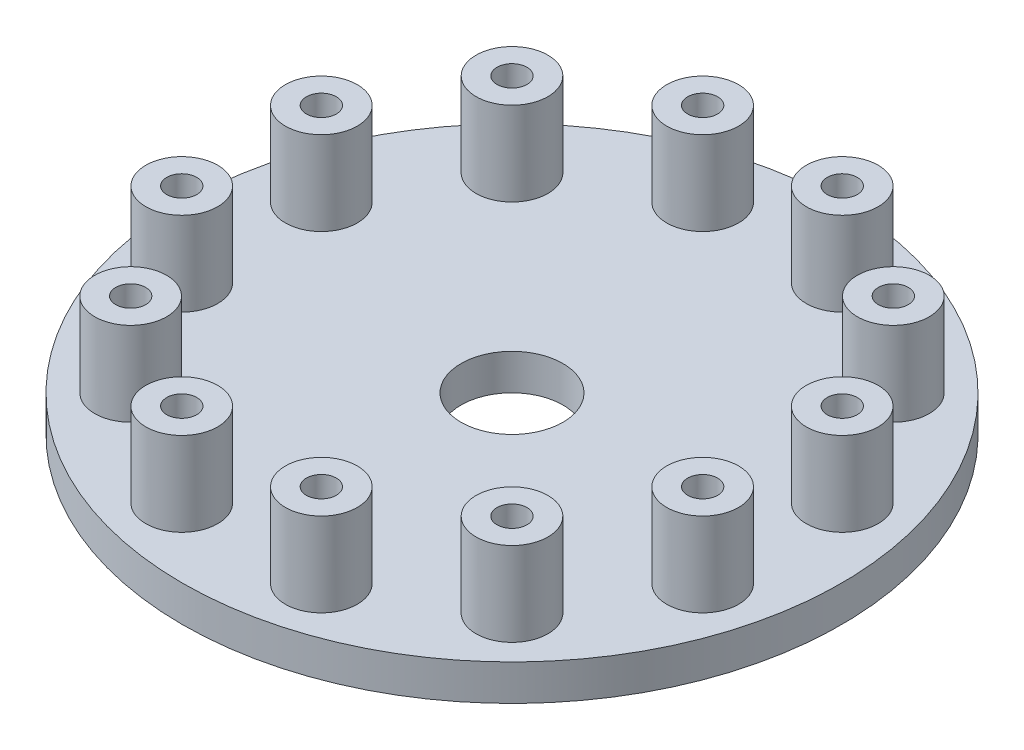
ISO-10303-21;
HEADER;
FILE_DESCRIPTION(('STEP AP214'),'2;1');
FILE_NAME('part.step','',(''),(''),'','','');
FILE_SCHEMA(('AUTOMOTIVE_DESIGN { 1 0 10303 214 1 1 1 1 }'));
ENDSEC;
DATA;
#1=APPLICATION_CONTEXT('core data for automotive mechanical design processes');
#2=APPLICATION_PROTOCOL_DEFINITION('international standard','automotive_design',2000,#1);
#3=PRODUCT_CONTEXT('',#1,'mechanical');
#4=PRODUCT('Part','Part','',(#3));
#5=PRODUCT_RELATED_PRODUCT_CATEGORY('part','',(#4));
#6=PRODUCT_DEFINITION_FORMATION('','',#4);
#7=PRODUCT_DEFINITION_CONTEXT('part definition',#1,'design');
#8=PRODUCT_DEFINITION('design','',#6,#7);
#9=PRODUCT_DEFINITION_SHAPE('','',#8);
#10=(LENGTH_UNIT() NAMED_UNIT(*) SI_UNIT(.MILLI.,.METRE.));
#11=(NAMED_UNIT(*) PLANE_ANGLE_UNIT() SI_UNIT($,.RADIAN.));
#12=(NAMED_UNIT(*) SI_UNIT($,.STERADIAN.) SOLID_ANGLE_UNIT());
#13=UNCERTAINTY_MEASURE_WITH_UNIT(LENGTH_MEASURE(1.E-05),#10,'distance_accuracy_value','');
#14=(GEOMETRIC_REPRESENTATION_CONTEXT(3) GLOBAL_UNCERTAINTY_ASSIGNED_CONTEXT((#13)) GLOBAL_UNIT_ASSIGNED_CONTEXT((#10,
#11,#12)) REPRESENTATION_CONTEXT('',''));
#15=CARTESIAN_POINT('',(0.,0.,0.));
#16=DIRECTION('',(0.,0.,1.));
#17=DIRECTION('',(1.,0.,0.));
#18=AXIS2_PLACEMENT_3D('',#15,#16,#17);
#19=CARTESIAN_POINT('',(15.9099025766973,10.,15.9099025766973));
#20=DIRECTION('',(0.,-1.,0.));
#21=DIRECTION('',(0.,0.,-1.));
#22=AXIS2_PLACEMENT_3D('',#19,#20,#21);
#23=PLANE('',#22);
#24=CARTESIAN_POINT('',(15.9099025766973,10.,15.9099025766973));
#25=DIRECTION('',(0.,-1.,0.));
#26=DIRECTION('',(0.,0.,-1.));
#27=AXIS2_PLACEMENT_3D('',#24,#25,#26);
#28=CIRCLE('',#27,2.99999999999999);
#29=CARTESIAN_POINT('',(15.9099025766973,10.,12.9099025766973));
#30=VERTEX_POINT('',#29);
#31=EDGE_CURVE('E86',#30,#30,#28,.T.);
#32=ORIENTED_EDGE('',*,*,#31,.F.);
#33=EDGE_LOOP('',(#32));
#34=FACE_BOUND('',#33,.T.);
#35=CARTESIAN_POINT('',(15.9099025766974,10.,15.9099025766972));
#36=DIRECTION('',(0.,1.,0.));
#37=DIRECTION('',(0.,0.,1.));
#38=AXIS2_PLACEMENT_3D('',#35,#36,#37);
#39=CIRCLE('',#38,1.25);
#40=CARTESIAN_POINT('',(15.9099025766974,10.,17.1599025766972));
#41=VERTEX_POINT('',#40);
#42=EDGE_CURVE('E169',#41,#41,#39,.T.);
#43=ORIENTED_EDGE('',*,*,#42,.F.);
#44=EDGE_LOOP('',(#43));
#45=FACE_BOUND('',#44,.T.);
#46=ADVANCED_FACE('F34',(#34,#45),#23,.F.);
#47=CARTESIAN_POINT('',(0.,3.,0.));
#48=DIRECTION('',(0.,1.,0.));
#49=DIRECTION('',(0.,0.,1.));
#50=AXIS2_PLACEMENT_3D('',#47,#48,#49);
#51=PLANE('',#50);
#52=CARTESIAN_POINT('',(21.733331091504,3.,-5.82342851480672));
#53=DIRECTION('',(0.,1.,0.));
#54=DIRECTION('',(0.,0.,1.));
#55=AXIS2_PLACEMENT_3D('',#52,#53,#54);
#56=CIRCLE('',#55,3.);
#57=CARTESIAN_POINT('',(21.733331091504,3.,-2.82342851480672));
#58=VERTEX_POINT('',#57);
#59=EDGE_CURVE('E79',#58,#58,#56,.T.);
#60=ORIENTED_EDGE('',*,*,#59,.F.);
#61=EDGE_LOOP('',(#60));
#62=FACE_BOUND('',#61,.T.);
#63=CARTESIAN_POINT('',(5.82342851480673,3.,-21.733331091504));
#64=DIRECTION('',(0.,1.,0.));
#65=DIRECTION('',(0.,0.,1.));
#66=AXIS2_PLACEMENT_3D('',#63,#64,#65);
#67=CIRCLE('',#66,3.);
#68=CARTESIAN_POINT('',(5.82342851480673,3.,-18.733331091504));
#69=VERTEX_POINT('',#68);
#70=EDGE_CURVE('E73',#69,#69,#67,.T.);
#71=ORIENTED_EDGE('',*,*,#70,.F.);
#72=EDGE_LOOP('',(#71));
#73=FACE_BOUND('',#72,.T.);
#74=CARTESIAN_POINT('',(-15.9099025766973,3.,-15.9099025766973));
#75=DIRECTION('',(0.,1.,0.));
#76=DIRECTION('',(0.,0.,1.));
#77=AXIS2_PLACEMENT_3D('',#74,#75,#76);
#78=CIRCLE('',#77,3.);
#79=CARTESIAN_POINT('',(-15.9099025766973,3.,-12.9099025766973));
#80=VERTEX_POINT('',#79);
#81=EDGE_CURVE('E67',#80,#80,#78,.T.);
#82=ORIENTED_EDGE('',*,*,#81,.F.);
#83=EDGE_LOOP('',(#82));
#84=FACE_BOUND('',#83,.T.);
#85=CARTESIAN_POINT('',(-21.733331091504,3.,5.82342851480671));
#86=DIRECTION('',(0.,1.,0.));
#87=DIRECTION('',(0.,0.,1.));
#88=AXIS2_PLACEMENT_3D('',#85,#86,#87);
#89=CIRCLE('',#88,2.99999999999999);
#90=CARTESIAN_POINT('',(-21.733331091504,3.,8.8234285148067));
#91=VERTEX_POINT('',#90);
#92=EDGE_CURVE('E61',#91,#91,#89,.T.);
#93=ORIENTED_EDGE('',*,*,#92,.F.);
#94=EDGE_LOOP('',(#93));
#95=FACE_BOUND('',#94,.T.);
#96=CARTESIAN_POINT('',(-5.82342851480673,3.,21.733331091504));
#97=DIRECTION('',(0.,1.,0.));
#98=DIRECTION('',(0.,0.,1.));
#99=AXIS2_PLACEMENT_3D('',#96,#97,#98);
#100=CIRCLE('',#99,3.);
#101=CARTESIAN_POINT('',(-5.82342851480673,3.,24.733331091504));
#102=VERTEX_POINT('',#101);
#103=EDGE_CURVE('E55',#102,#102,#100,.T.);
#104=ORIENTED_EDGE('',*,*,#103,.F.);
#105=EDGE_LOOP('',(#104));
#106=FACE_BOUND('',#105,.T.);
#107=CARTESIAN_POINT('',(15.9099025766973,3.,15.9099025766973));
#108=DIRECTION('',(0.,1.,0.));
#109=DIRECTION('',(0.,0.,1.));
#110=AXIS2_PLACEMENT_3D('',#107,#108,#109);
#111=CIRCLE('',#110,2.99999999999999);
#112=CARTESIAN_POINT('',(15.9099025766973,3.,18.9099025766973));
#113=VERTEX_POINT('',#112);
#114=EDGE_CURVE('E49',#113,#113,#111,.T.);
#115=ORIENTED_EDGE('',*,*,#114,.F.);
#116=EDGE_LOOP('',(#115));
#117=FACE_BOUND('',#116,.T.);
#118=CARTESIAN_POINT('',(0.,3.,0.));
#119=DIRECTION('',(0.,1.,0.));
#120=DIRECTION('',(0.,0.,1.));
#121=AXIS2_PLACEMENT_3D('',#118,#119,#120);
#122=CIRCLE('',#121,27.5);
#123=CARTESIAN_POINT('',(0.,3.,27.5));
#124=VERTEX_POINT('',#123);
#125=EDGE_CURVE('E10',#124,#124,#122,.T.);
#126=ORIENTED_EDGE('',*,*,#125,.T.);
#127=EDGE_LOOP('',(#126));
#128=FACE_BOUND('',#127,.T.);
#129=CARTESIAN_POINT('',(21.733331091504,3.,5.82342851480673));
#130=DIRECTION('',(0.,1.,0.));
#131=DIRECTION('',(0.,0.,1.));
#132=AXIS2_PLACEMENT_3D('',#129,#130,#131);
#133=CIRCLE('',#132,2.99999999999999);
#134=CARTESIAN_POINT('',(21.733331091504,3.,8.82342851480673));
#135=VERTEX_POINT('',#134);
#136=EDGE_CURVE('E45',#135,#135,#133,.T.);
#137=ORIENTED_EDGE('',*,*,#136,.F.);
#138=EDGE_LOOP('',(#137));
#139=FACE_BOUND('',#138,.T.);
#140=CARTESIAN_POINT('',(5.8234285148067,3.,21.733331091504));
#141=DIRECTION('',(0.,1.,0.));
#142=DIRECTION('',(0.,0.,1.));
#143=AXIS2_PLACEMENT_3D('',#140,#141,#142);
#144=CIRCLE('',#143,3.);
#145=CARTESIAN_POINT('',(5.8234285148067,3.,24.733331091504));
#146=VERTEX_POINT('',#145);
#147=EDGE_CURVE('E52',#146,#146,#144,.T.);
#148=ORIENTED_EDGE('',*,*,#147,.F.);
#149=EDGE_LOOP('',(#148));
#150=FACE_BOUND('',#149,.T.);
#151=CARTESIAN_POINT('',(-15.9099025766973,3.,15.9099025766973));
#152=DIRECTION('',(0.,1.,0.));
#153=DIRECTION('',(0.,0.,1.));
#154=AXIS2_PLACEMENT_3D('',#151,#152,#153);
#155=CIRCLE('',#154,3.);
#156=CARTESIAN_POINT('',(-15.9099025766973,3.,18.9099025766973));
#157=VERTEX_POINT('',#156);
#158=EDGE_CURVE('E58',#157,#157,#155,.T.);
#159=ORIENTED_EDGE('',*,*,#158,.F.);
#160=EDGE_LOOP('',(#159));
#161=FACE_BOUND('',#160,.T.);
#162=CARTESIAN_POINT('',(-21.733331091504,3.,-5.82342851480673));
#163=DIRECTION('',(0.,1.,0.));
#164=DIRECTION('',(0.,0.,1.));
#165=AXIS2_PLACEMENT_3D('',#162,#163,#164);
#166=CIRCLE('',#165,3.);
#167=CARTESIAN_POINT('',(-21.733331091504,3.,-2.82342851480673));
#168=VERTEX_POINT('',#167);
#169=EDGE_CURVE('E64',#168,#168,#166,.T.);
#170=ORIENTED_EDGE('',*,*,#169,.F.);
#171=EDGE_LOOP('',(#170));
#172=FACE_BOUND('',#171,.T.);
#173=CARTESIAN_POINT('',(-5.82342851480671,3.,-21.733331091504));
#174=DIRECTION('',(0.,1.,0.));
#175=DIRECTION('',(0.,0.,1.));
#176=AXIS2_PLACEMENT_3D('',#173,#174,#175);
#177=CIRCLE('',#176,3.);
#178=CARTESIAN_POINT('',(-5.82342851480671,3.,-18.733331091504));
#179=VERTEX_POINT('',#178);
#180=EDGE_CURVE('E70',#179,#179,#177,.T.);
#181=ORIENTED_EDGE('',*,*,#180,.F.);
#182=EDGE_LOOP('',(#181));
#183=FACE_BOUND('',#182,.T.);
#184=CARTESIAN_POINT('',(15.9099025766973,3.,-15.9099025766973));
#185=DIRECTION('',(0.,1.,0.));
#186=DIRECTION('',(0.,0.,1.));
#187=AXIS2_PLACEMENT_3D('',#184,#185,#186);
#188=CIRCLE('',#187,2.99999999999999);
#189=CARTESIAN_POINT('',(15.9099025766973,3.,-12.9099025766973));
#190=VERTEX_POINT('',#189);
#191=EDGE_CURVE('E76',#190,#190,#188,.T.);
#192=ORIENTED_EDGE('',*,*,#191,.F.);
#193=EDGE_LOOP('',(#192));
#194=FACE_BOUND('',#193,.T.);
#195=CARTESIAN_POINT('',(0.,3.,0.));
#196=DIRECTION('',(0.,1.,0.));
#197=DIRECTION('',(0.,0.,1.));
#198=AXIS2_PLACEMENT_3D('',#195,#196,#197);
#199=CIRCLE('',#198,4.25);
#200=CARTESIAN_POINT('',(0.,3.,4.25));
#201=VERTEX_POINT('',#200);
#202=EDGE_CURVE('E82',#201,#201,#199,.T.);
#203=ORIENTED_EDGE('',*,*,#202,.F.);
#204=EDGE_LOOP('',(#203));
#205=FACE_BOUND('',#204,.T.);
#206=ADVANCED_FACE('F218',(#62,#73,#84,#95,#106,#117,#128,#139,#150,#161,#172,#183,#194,#205),
#51,.T.);
#207=CARTESIAN_POINT('',(0.,0.,0.));
#208=DIRECTION('',(0.,1.,0.));
#209=DIRECTION('',(0.,0.,1.));
#210=AXIS2_PLACEMENT_3D('',#207,#208,#209);
#211=PLANE('',#210);
#212=CARTESIAN_POINT('',(5.82342851480645,0.,-21.7333310915041));
#213=DIRECTION('',(0.,1.,0.));
#214=DIRECTION('',(0.,0.,1.));
#215=AXIS2_PLACEMENT_3D('',#212,#213,#214);
#216=CIRCLE('',#215,1.25);
#217=CARTESIAN_POINT('',(5.82342851480645,0.,-20.4833310915041));
#218=VERTEX_POINT('',#217);
#219=EDGE_CURVE('E190',#218,#218,#216,.T.);
#220=ORIENTED_EDGE('',*,*,#219,.T.);
#221=EDGE_LOOP('',(#220));
#222=FACE_BOUND('',#221,.T.);
#223=CARTESIAN_POINT('',(15.9099025766971,0.,-15.9099025766975));
#224=DIRECTION('',(0.,1.,0.));
#225=DIRECTION('',(0.,0.,1.));
#226=AXIS2_PLACEMENT_3D('',#223,#224,#225);
#227=CIRCLE('',#226,1.25);
#228=CARTESIAN_POINT('',(15.9099025766971,0.,-14.6599025766975));
#229=VERTEX_POINT('',#228);
#230=EDGE_CURVE('E184',#229,#229,#227,.T.);
#231=ORIENTED_EDGE('',*,*,#230,.T.);
#232=EDGE_LOOP('',(#231));
#233=FACE_BOUND('',#232,.T.);
#234=CARTESIAN_POINT('',(21.733331091504,0.,-5.82342851480694));
#235=DIRECTION('',(0.,1.,0.));
#236=DIRECTION('',(0.,0.,1.));
#237=AXIS2_PLACEMENT_3D('',#234,#235,#236);
#238=CIRCLE('',#237,1.25);
#239=CARTESIAN_POINT('',(21.733331091504,0.,-4.57342851480694));
#240=VERTEX_POINT('',#239);
#241=EDGE_CURVE('E178',#240,#240,#238,.T.);
#242=ORIENTED_EDGE('',*,*,#241,.T.);
#243=EDGE_LOOP('',(#242));
#244=FACE_BOUND('',#243,.T.);
#245=CARTESIAN_POINT('',(21.7333310915041,0.,5.82342851480652));
#246=DIRECTION('',(0.,1.,0.));
#247=DIRECTION('',(0.,0.,1.));
#248=AXIS2_PLACEMENT_3D('',#245,#246,#247);
#249=CIRCLE('',#248,1.25);
#250=CARTESIAN_POINT('',(21.7333310915041,0.,7.07342851480652));
#251=VERTEX_POINT('',#250);
#252=EDGE_CURVE('E172',#251,#251,#249,.T.);
#253=ORIENTED_EDGE('',*,*,#252,.T.);
#254=EDGE_LOOP('',(#253));
#255=FACE_BOUND('',#254,.T.);
#256=CARTESIAN_POINT('',(15.9099025766974,0.,15.9099025766972));
#257=DIRECTION('',(0.,1.,0.));
#258=DIRECTION('',(0.,0.,1.));
#259=AXIS2_PLACEMENT_3D('',#256,#257,#258);
#260=CIRCLE('',#259,1.25);
#261=CARTESIAN_POINT('',(15.9099025766974,0.,17.1599025766972));
#262=VERTEX_POINT('',#261);
#263=EDGE_CURVE('E166',#262,#262,#260,.T.);
#264=ORIENTED_EDGE('',*,*,#263,.T.);
#265=EDGE_LOOP('',(#264));
#266=FACE_BOUND('',#265,.T.);
#267=CARTESIAN_POINT('',(5.82342851480671,0.,21.733331091504));
#268=DIRECTION('',(0.,1.,0.));
#269=DIRECTION('',(0.,0.,1.));
#270=AXIS2_PLACEMENT_3D('',#267,#268,#269);
#271=CIRCLE('',#270,1.25);
#272=CARTESIAN_POINT('',(5.82342851480671,0.,22.983331091504));
#273=VERTEX_POINT('',#272);
#274=EDGE_CURVE('E160',#273,#273,#271,.T.);
#275=ORIENTED_EDGE('',*,*,#274,.T.);
#276=EDGE_LOOP('',(#275));
#277=FACE_BOUND('',#276,.T.);
#278=CARTESIAN_POINT('',(-5.8234285148066,0.,21.7333310915041));
#279=DIRECTION('',(0.,1.,0.));
#280=DIRECTION('',(0.,0.,1.));
#281=AXIS2_PLACEMENT_3D('',#278,#279,#280);
#282=CIRCLE('',#281,1.25);
#283=CARTESIAN_POINT('',(-5.8234285148066,0.,22.9833310915041));
#284=VERTEX_POINT('',#283);
#285=EDGE_CURVE('E154',#284,#284,#282,.T.);
#286=ORIENTED_EDGE('',*,*,#285,.T.);
#287=EDGE_LOOP('',(#286));
#288=FACE_BOUND('',#287,.T.);
#289=CARTESIAN_POINT('',(-15.9099025766973,0.,15.9099025766974));
#290=DIRECTION('',(0.,1.,0.));
#291=DIRECTION('',(0.,0.,1.));
#292=AXIS2_PLACEMENT_3D('',#289,#290,#291);
#293=CIRCLE('',#292,1.25);
#294=CARTESIAN_POINT('',(-15.9099025766973,0.,17.1599025766974));
#295=VERTEX_POINT('',#294);
#296=EDGE_CURVE('E148',#295,#295,#293,.T.);
#297=ORIENTED_EDGE('',*,*,#296,.T.);
#298=EDGE_LOOP('',(#297));
#299=FACE_BOUND('',#298,.T.);
#300=CARTESIAN_POINT('',(-21.733331091504,0.,5.82342851480679));
#301=DIRECTION('',(0.,1.,0.));
#302=DIRECTION('',(0.,0.,1.));
#303=AXIS2_PLACEMENT_3D('',#300,#301,#302);
#304=CIRCLE('',#303,1.25);
#305=CARTESIAN_POINT('',(-21.733331091504,0.,7.07342851480678));
#306=VERTEX_POINT('',#305);
#307=EDGE_CURVE('E142',#306,#306,#304,.T.);
#308=ORIENTED_EDGE('',*,*,#307,.T.);
#309=EDGE_LOOP('',(#308));
#310=FACE_BOUND('',#309,.T.);
#311=CARTESIAN_POINT('',(-21.7333310915041,0.,-5.82342851480668));
#312=DIRECTION('',(0.,1.,0.));
#313=DIRECTION('',(0.,0.,1.));
#314=AXIS2_PLACEMENT_3D('',#311,#312,#313);
#315=CIRCLE('',#314,1.25);
#316=CARTESIAN_POINT('',(-21.7333310915041,0.,-4.57342851480668));
#317=VERTEX_POINT('',#316);
#318=EDGE_CURVE('E136',#317,#317,#315,.T.);
#319=ORIENTED_EDGE('',*,*,#318,.T.);
#320=EDGE_LOOP('',(#319));
#321=FACE_BOUND('',#320,.T.);
#322=CARTESIAN_POINT('',(-15.9099025766973,0.,-15.9099025766973));
#323=DIRECTION('',(0.,1.,0.));
#324=DIRECTION('',(0.,0.,1.));
#325=AXIS2_PLACEMENT_3D('',#322,#323,#324);
#326=CIRCLE('',#325,1.25);
#327=CARTESIAN_POINT('',(-15.9099025766973,0.,-14.6599025766973));
#328=VERTEX_POINT('',#327);
#329=EDGE_CURVE('E130',#328,#328,#326,.T.);
#330=ORIENTED_EDGE('',*,*,#329,.T.);
#331=EDGE_LOOP('',(#330));
#332=FACE_BOUND('',#331,.T.);
#333=CARTESIAN_POINT('',(-5.82342851480671,0.,-21.733331091504));
#334=DIRECTION('',(0.,1.,0.));
#335=DIRECTION('',(0.,0.,1.));
#336=AXIS2_PLACEMENT_3D('',#333,#334,#335);
#337=CIRCLE('',#336,1.25);
#338=CARTESIAN_POINT('',(-5.82342851480671,0.,-20.483331091504));
#339=VERTEX_POINT('',#338);
#340=EDGE_CURVE('E124',#339,#339,#337,.T.);
#341=ORIENTED_EDGE('',*,*,#340,.T.);
#342=EDGE_LOOP('',(#341));
#343=FACE_BOUND('',#342,.T.);
#344=CARTESIAN_POINT('',(0.,0.,0.));
#345=DIRECTION('',(0.,1.,0.));
#346=DIRECTION('',(0.,0.,1.));
#347=AXIS2_PLACEMENT_3D('',#344,#345,#346);
#348=CIRCLE('',#347,27.5);
#349=CARTESIAN_POINT('',(0.,0.,27.5));
#350=VERTEX_POINT('',#349);
#351=EDGE_CURVE('E38',#350,#350,#348,.T.);
#352=ORIENTED_EDGE('',*,*,#351,.F.);
#353=EDGE_LOOP('',(#352));
#354=FACE_BOUND('',#353,.T.);
#355=CARTESIAN_POINT('',(0.,0.,0.));
#356=DIRECTION('',(0.,1.,0.));
#357=DIRECTION('',(0.,0.,1.));
#358=AXIS2_PLACEMENT_3D('',#355,#356,#357);
#359=CIRCLE('',#358,4.25);
#360=CARTESIAN_POINT('',(0.,0.,4.25));
#361=VERTEX_POINT('',#360);
#362=EDGE_CURVE('E83',#361,#361,#359,.T.);
#363=ORIENTED_EDGE('',*,*,#362,.T.);
#364=EDGE_LOOP('',(#363));
#365=FACE_BOUND('',#364,.T.);
#366=ADVANCED_FACE('F224',(#222,#233,#244,#255,#266,#277,#288,#299,#310,#321,#332,#343,#354,
#365),#211,.F.);
#367=CARTESIAN_POINT('',(0.,3.,0.));
#368=DIRECTION('',(0.,-1.,0.));
#369=DIRECTION('',(0.,0.,-1.));
#370=AXIS2_PLACEMENT_3D('',#367,#368,#369);
#371=CYLINDRICAL_SURFACE('',#370,27.5);
#372=ORIENTED_EDGE('',*,*,#125,.F.);
#373=EDGE_LOOP('',(#372));
#374=FACE_BOUND('',#373,.T.);
#375=ORIENTED_EDGE('',*,*,#351,.T.);
#376=EDGE_LOOP('',(#375));
#377=FACE_BOUND('',#376,.T.);
#378=ADVANCED_FACE('F36',(#374,#377),#371,.T.);
#379=CARTESIAN_POINT('',(0.,3.,0.));
#380=DIRECTION('',(0.,-1.,0.));
#381=DIRECTION('',(0.,0.,-1.));
#382=AXIS2_PLACEMENT_3D('',#379,#380,#381);
#383=CYLINDRICAL_SURFACE('',#382,4.25);
#384=ORIENTED_EDGE('',*,*,#202,.T.);
#385=EDGE_LOOP('',(#384));
#386=FACE_BOUND('',#385,.T.);
#387=ORIENTED_EDGE('',*,*,#362,.F.);
#388=EDGE_LOOP('',(#387));
#389=FACE_BOUND('',#388,.T.);
#390=ADVANCED_FACE('F236',(#386,#389),#383,.F.);
#391=CARTESIAN_POINT('',(15.9099025766973,10.,15.9099025766973));
#392=DIRECTION('',(0.,-1.,0.));
#393=DIRECTION('',(0.,0.,-1.));
#394=AXIS2_PLACEMENT_3D('',#391,#392,#393);
#395=CYLINDRICAL_SURFACE('',#394,2.99999999999999);
#396=ORIENTED_EDGE('',*,*,#114,.T.);
#397=EDGE_LOOP('',(#396));
#398=FACE_BOUND('',#397,.T.);
#399=ORIENTED_EDGE('',*,*,#31,.T.);
#400=EDGE_LOOP('',(#399));
#401=FACE_BOUND('',#400,.T.);
#402=ADVANCED_FACE('F233',(#398,#401),#395,.T.);
#403=CARTESIAN_POINT('',(21.733331091504,10.,5.82342851480673));
#404=DIRECTION('',(0.,-1.,0.));
#405=DIRECTION('',(0.,0.,-1.));
#406=AXIS2_PLACEMENT_3D('',#403,#404,#405);
#407=CYLINDRICAL_SURFACE('',#406,2.99999999999999);
#408=ORIENTED_EDGE('',*,*,#136,.T.);
#409=EDGE_LOOP('',(#408));
#410=FACE_BOUND('',#409,.T.);
#411=CARTESIAN_POINT('',(21.733331091504,10.,5.82342851480673));
#412=DIRECTION('',(0.,-1.,0.));
#413=DIRECTION('',(0.,0.,-1.));
#414=AXIS2_PLACEMENT_3D('',#411,#412,#413);
#415=CIRCLE('',#414,2.99999999999999);
#416=CARTESIAN_POINT('',(21.733331091504,10.,2.82342851480674));
#417=VERTEX_POINT('',#416);
#418=EDGE_CURVE('E91',#417,#417,#415,.T.);
#419=ORIENTED_EDGE('',*,*,#418,.T.);
#420=EDGE_LOOP('',(#419));
#421=FACE_BOUND('',#420,.T.);
#422=ADVANCED_FACE('F231',(#410,#421),#407,.T.);
#423=CARTESIAN_POINT('',(21.733331091504,10.,5.82342851480673));
#424=DIRECTION('',(0.,-1.,0.));
#425=DIRECTION('',(0.,0.,-1.));
#426=AXIS2_PLACEMENT_3D('',#423,#424,#425);
#427=PLANE('',#426);
#428=CARTESIAN_POINT('',(21.7333310915041,10.,5.82342851480652));
#429=DIRECTION('',(0.,1.,0.));
#430=DIRECTION('',(0.,0.,1.));
#431=AXIS2_PLACEMENT_3D('',#428,#429,#430);
#432=CIRCLE('',#431,1.25);
#433=CARTESIAN_POINT('',(21.7333310915041,10.,7.07342851480653));
#434=VERTEX_POINT('',#433);
#435=EDGE_CURVE('E175',#434,#434,#432,.T.);
#436=ORIENTED_EDGE('',*,*,#435,.F.);
#437=EDGE_LOOP('',(#436));
#438=FACE_BOUND('',#437,.T.);
#439=ORIENTED_EDGE('',*,*,#418,.F.);
#440=EDGE_LOOP('',(#439));
#441=FACE_BOUND('',#440,.T.);
#442=ADVANCED_FACE('F493',(#438,#441),#427,.F.);
#443=CARTESIAN_POINT('',(21.733331091504,10.,-5.82342851480672));
#444=DIRECTION('',(0.,-1.,0.));
#445=DIRECTION('',(0.,0.,-1.));
#446=AXIS2_PLACEMENT_3D('',#443,#444,#445);
#447=CYLINDRICAL_SURFACE('',#446,3.);
#448=ORIENTED_EDGE('',*,*,#59,.T.);
#449=EDGE_LOOP('',(#448));
#450=FACE_BOUND('',#449,.T.);
#451=CARTESIAN_POINT('',(21.733331091504,10.,-5.82342851480672));
#452=DIRECTION('',(0.,-1.,0.));
#453=DIRECTION('',(0.,0.,-1.));
#454=AXIS2_PLACEMENT_3D('',#451,#452,#453);
#455=CIRCLE('',#454,3.);
#456=CARTESIAN_POINT('',(21.733331091504,10.,-8.82342851480672));
#457=VERTEX_POINT('',#456);
#458=EDGE_CURVE('E94',#457,#457,#455,.T.);
#459=ORIENTED_EDGE('',*,*,#458,.T.);
#460=EDGE_LOOP('',(#459));
#461=FACE_BOUND('',#460,.T.);
#462=ADVANCED_FACE('F487',(#450,#461),#447,.T.);
#463=CARTESIAN_POINT('',(21.733331091504,10.,-5.82342851480672));
#464=DIRECTION('',(0.,-1.,0.));
#465=DIRECTION('',(0.,0.,-1.));
#466=AXIS2_PLACEMENT_3D('',#463,#464,#465);
#467=PLANE('',#466);
#468=CARTESIAN_POINT('',(21.733331091504,10.,-5.82342851480694));
#469=DIRECTION('',(0.,1.,0.));
#470=DIRECTION('',(0.,0.,1.));
#471=AXIS2_PLACEMENT_3D('',#468,#469,#470);
#472=CIRCLE('',#471,1.25);
#473=CARTESIAN_POINT('',(21.733331091504,10.,-4.57342851480694));
#474=VERTEX_POINT('',#473);
#475=EDGE_CURVE('E181',#474,#474,#472,.T.);
#476=ORIENTED_EDGE('',*,*,#475,.F.);
#477=EDGE_LOOP('',(#476));
#478=FACE_BOUND('',#477,.T.);
#479=ORIENTED_EDGE('',*,*,#458,.F.);
#480=EDGE_LOOP('',(#479));
#481=FACE_BOUND('',#480,.T.);
#482=ADVANCED_FACE('F479',(#478,#481),#467,.F.);
#483=CARTESIAN_POINT('',(15.9099025766973,10.,-15.9099025766973));
#484=DIRECTION('',(0.,-1.,0.));
#485=DIRECTION('',(0.,0.,-1.));
#486=AXIS2_PLACEMENT_3D('',#483,#484,#485);
#487=CYLINDRICAL_SURFACE('',#486,2.99999999999999);
#488=ORIENTED_EDGE('',*,*,#191,.T.);
#489=EDGE_LOOP('',(#488));
#490=FACE_BOUND('',#489,.T.);
#491=CARTESIAN_POINT('',(15.9099025766973,10.,-15.9099025766973));
#492=DIRECTION('',(0.,-1.,0.));
#493=DIRECTION('',(0.,0.,-1.));
#494=AXIS2_PLACEMENT_3D('',#491,#492,#493);
#495=CIRCLE('',#494,2.99999999999999);
#496=CARTESIAN_POINT('',(15.9099025766973,10.,-18.9099025766973));
#497=VERTEX_POINT('',#496);
#498=EDGE_CURVE('E97',#497,#497,#495,.T.);
#499=ORIENTED_EDGE('',*,*,#498,.T.);
#500=EDGE_LOOP('',(#499));
#501=FACE_BOUND('',#500,.T.);
#502=ADVANCED_FACE('F214',(#490,#501),#487,.T.);
#503=CARTESIAN_POINT('',(15.9099025766973,10.,-15.9099025766973));
#504=DIRECTION('',(0.,-1.,0.));
#505=DIRECTION('',(0.,0.,-1.));
#506=AXIS2_PLACEMENT_3D('',#503,#504,#505);
#507=PLANE('',#506);
#508=CARTESIAN_POINT('',(15.9099025766971,10.,-15.9099025766975));
#509=DIRECTION('',(0.,1.,0.));
#510=DIRECTION('',(0.,0.,1.));
#511=AXIS2_PLACEMENT_3D('',#508,#509,#510);
#512=CIRCLE('',#511,1.25);
#513=CARTESIAN_POINT('',(15.9099025766971,10.,-14.6599025766975));
#514=VERTEX_POINT('',#513);
#515=EDGE_CURVE('E187',#514,#514,#512,.T.);
#516=ORIENTED_EDGE('',*,*,#515,.F.);
#517=EDGE_LOOP('',(#516));
#518=FACE_BOUND('',#517,.T.);
#519=ORIENTED_EDGE('',*,*,#498,.F.);
#520=EDGE_LOOP('',(#519));
#521=FACE_BOUND('',#520,.T.);
#522=ADVANCED_FACE('F208',(#518,#521),#507,.F.);
#523=CARTESIAN_POINT('',(5.82342851480673,10.,-21.733331091504));
#524=DIRECTION('',(0.,-1.,0.));
#525=DIRECTION('',(0.,0.,-1.));
#526=AXIS2_PLACEMENT_3D('',#523,#524,#525);
#527=CYLINDRICAL_SURFACE('',#526,3.);
#528=ORIENTED_EDGE('',*,*,#70,.T.);
#529=EDGE_LOOP('',(#528));
#530=FACE_BOUND('',#529,.T.);
#531=CARTESIAN_POINT('',(5.82342851480673,10.,-21.733331091504));
#532=DIRECTION('',(0.,-1.,0.));
#533=DIRECTION('',(0.,0.,-1.));
#534=AXIS2_PLACEMENT_3D('',#531,#532,#533);
#535=CIRCLE('',#534,3.);
#536=CARTESIAN_POINT('',(5.82342851480673,10.,-24.733331091504));
#537=VERTEX_POINT('',#536);
#538=EDGE_CURVE('E100',#537,#537,#535,.T.);
#539=ORIENTED_EDGE('',*,*,#538,.T.);
#540=EDGE_LOOP('',(#539));
#541=FACE_BOUND('',#540,.T.);
#542=ADVANCED_FACE('F203',(#530,#541),#527,.T.);
#543=CARTESIAN_POINT('',(5.82342851480673,10.,-21.733331091504));
#544=DIRECTION('',(0.,-1.,0.));
#545=DIRECTION('',(0.,0.,-1.));
#546=AXIS2_PLACEMENT_3D('',#543,#544,#545);
#547=PLANE('',#546);
#548=CARTESIAN_POINT('',(5.82342851480645,10.,-21.7333310915041));
#549=DIRECTION('',(0.,1.,0.));
#550=DIRECTION('',(0.,0.,1.));
#551=AXIS2_PLACEMENT_3D('',#548,#549,#550);
#552=CIRCLE('',#551,1.25);
#553=CARTESIAN_POINT('',(5.82342851480645,10.,-20.4833310915041));
#554=VERTEX_POINT('',#553);
#555=EDGE_CURVE('E193',#554,#554,#552,.T.);
#556=ORIENTED_EDGE('',*,*,#555,.F.);
#557=EDGE_LOOP('',(#556));
#558=FACE_BOUND('',#557,.T.);
#559=ORIENTED_EDGE('',*,*,#538,.F.);
#560=EDGE_LOOP('',(#559));
#561=FACE_BOUND('',#560,.T.);
#562=ADVANCED_FACE('F199',(#558,#561),#547,.F.);
#563=CARTESIAN_POINT('',(-5.82342851480671,10.,-21.733331091504));
#564=DIRECTION('',(0.,-1.,0.));
#565=DIRECTION('',(0.,0.,-1.));
#566=AXIS2_PLACEMENT_3D('',#563,#564,#565);
#567=CYLINDRICAL_SURFACE('',#566,3.);
#568=ORIENTED_EDGE('',*,*,#180,.T.);
#569=EDGE_LOOP('',(#568));
#570=FACE_BOUND('',#569,.T.);
#571=CARTESIAN_POINT('',(-5.82342851480671,10.,-21.733331091504));
#572=DIRECTION('',(0.,-1.,0.));
#573=DIRECTION('',(0.,0.,-1.));
#574=AXIS2_PLACEMENT_3D('',#571,#572,#573);
#575=CIRCLE('',#574,3.);
#576=CARTESIAN_POINT('',(-5.82342851480671,10.,-24.733331091504));
#577=VERTEX_POINT('',#576);
#578=EDGE_CURVE('E103',#577,#577,#575,.T.);
#579=ORIENTED_EDGE('',*,*,#578,.T.);
#580=EDGE_LOOP('',(#579));
#581=FACE_BOUND('',#580,.T.);
#582=ADVANCED_FACE('F202',(#570,#581),#567,.T.);
#583=CARTESIAN_POINT('',(-5.82342851480671,10.,-21.733331091504));
#584=DIRECTION('',(0.,-1.,0.));
#585=DIRECTION('',(0.,0.,-1.));
#586=AXIS2_PLACEMENT_3D('',#583,#584,#585);
#587=PLANE('',#586);
#588=CARTESIAN_POINT('',(-5.82342851480671,10.,-21.733331091504));
#589=DIRECTION('',(0.,1.,0.));
#590=DIRECTION('',(0.,0.,1.));
#591=AXIS2_PLACEMENT_3D('',#588,#589,#590);
#592=CIRCLE('',#591,1.25);
#593=CARTESIAN_POINT('',(-5.82342851480671,10.,-20.483331091504));
#594=VERTEX_POINT('',#593);
#595=EDGE_CURVE('E127',#594,#594,#592,.T.);
#596=ORIENTED_EDGE('',*,*,#595,.F.);
#597=EDGE_LOOP('',(#596));
#598=FACE_BOUND('',#597,.T.);
#599=ORIENTED_EDGE('',*,*,#578,.F.);
#600=EDGE_LOOP('',(#599));
#601=FACE_BOUND('',#600,.T.);
#602=ADVANCED_FACE('F284',(#598,#601),#587,.F.);
#603=CARTESIAN_POINT('',(-15.9099025766973,10.,-15.9099025766973));
#604=DIRECTION('',(0.,-1.,0.));
#605=DIRECTION('',(0.,0.,-1.));
#606=AXIS2_PLACEMENT_3D('',#603,#604,#605);
#607=CYLINDRICAL_SURFACE('',#606,3.);
#608=ORIENTED_EDGE('',*,*,#81,.T.);
#609=EDGE_LOOP('',(#608));
#610=FACE_BOUND('',#609,.T.);
#611=CARTESIAN_POINT('',(-15.9099025766973,10.,-15.9099025766973));
#612=DIRECTION('',(0.,-1.,0.));
#613=DIRECTION('',(0.,0.,-1.));
#614=AXIS2_PLACEMENT_3D('',#611,#612,#613);
#615=CIRCLE('',#614,3.);
#616=CARTESIAN_POINT('',(-15.9099025766973,10.,-18.9099025766973));
#617=VERTEX_POINT('',#616);
#618=EDGE_CURVE('E106',#617,#617,#615,.T.);
#619=ORIENTED_EDGE('',*,*,#618,.T.);
#620=EDGE_LOOP('',(#619));
#621=FACE_BOUND('',#620,.T.);
#622=ADVANCED_FACE('F287',(#610,#621),#607,.T.);
#623=CARTESIAN_POINT('',(-15.9099025766973,10.,-15.9099025766973));
#624=DIRECTION('',(0.,-1.,0.));
#625=DIRECTION('',(0.,0.,-1.));
#626=AXIS2_PLACEMENT_3D('',#623,#624,#625);
#627=PLANE('',#626);
#628=CARTESIAN_POINT('',(-15.9099025766973,10.,-15.9099025766973));
#629=DIRECTION('',(0.,1.,0.));
#630=DIRECTION('',(0.,0.,1.));
#631=AXIS2_PLACEMENT_3D('',#628,#629,#630);
#632=CIRCLE('',#631,1.25);
#633=CARTESIAN_POINT('',(-15.9099025766973,10.,-14.6599025766973));
#634=VERTEX_POINT('',#633);
#635=EDGE_CURVE('E133',#634,#634,#632,.T.);
#636=ORIENTED_EDGE('',*,*,#635,.F.);
#637=EDGE_LOOP('',(#636));
#638=FACE_BOUND('',#637,.T.);
#639=ORIENTED_EDGE('',*,*,#618,.F.);
#640=EDGE_LOOP('',(#639));
#641=FACE_BOUND('',#640,.T.);
#642=ADVANCED_FACE('F299',(#638,#641),#627,.F.);
#643=CARTESIAN_POINT('',(-21.733331091504,10.,-5.82342851480673));
#644=DIRECTION('',(0.,-1.,0.));
#645=DIRECTION('',(0.,0.,-1.));
#646=AXIS2_PLACEMENT_3D('',#643,#644,#645);
#647=CYLINDRICAL_SURFACE('',#646,3.);
#648=ORIENTED_EDGE('',*,*,#169,.T.);
#649=EDGE_LOOP('',(#648));
#650=FACE_BOUND('',#649,.T.);
#651=CARTESIAN_POINT('',(-21.733331091504,10.,-5.82342851480673));
#652=DIRECTION('',(0.,-1.,0.));
#653=DIRECTION('',(0.,0.,-1.));
#654=AXIS2_PLACEMENT_3D('',#651,#652,#653);
#655=CIRCLE('',#654,3.);
#656=CARTESIAN_POINT('',(-21.733331091504,10.,-8.82342851480673));
#657=VERTEX_POINT('',#656);
#658=EDGE_CURVE('E109',#657,#657,#655,.T.);
#659=ORIENTED_EDGE('',*,*,#658,.T.);
#660=EDGE_LOOP('',(#659));
#661=FACE_BOUND('',#660,.T.);
#662=ADVANCED_FACE('F303',(#650,#661),#647,.T.);
#663=CARTESIAN_POINT('',(-21.733331091504,10.,-5.82342851480673));
#664=DIRECTION('',(0.,-1.,0.));
#665=DIRECTION('',(0.,0.,-1.));
#666=AXIS2_PLACEMENT_3D('',#663,#664,#665);
#667=PLANE('',#666);
#668=CARTESIAN_POINT('',(-21.7333310915041,10.,-5.82342851480668));
#669=DIRECTION('',(0.,1.,0.));
#670=DIRECTION('',(0.,0.,1.));
#671=AXIS2_PLACEMENT_3D('',#668,#669,#670);
#672=CIRCLE('',#671,1.25);
#673=CARTESIAN_POINT('',(-21.7333310915041,10.,-4.57342851480668));
#674=VERTEX_POINT('',#673);
#675=EDGE_CURVE('E139',#674,#674,#672,.T.);
#676=ORIENTED_EDGE('',*,*,#675,.F.);
#677=EDGE_LOOP('',(#676));
#678=FACE_BOUND('',#677,.T.);
#679=ORIENTED_EDGE('',*,*,#658,.F.);
#680=EDGE_LOOP('',(#679));
#681=FACE_BOUND('',#680,.T.);
#682=ADVANCED_FACE('F307',(#678,#681),#667,.F.);
#683=CARTESIAN_POINT('',(-21.733331091504,10.,5.82342851480671));
#684=DIRECTION('',(0.,-1.,0.));
#685=DIRECTION('',(0.,0.,-1.));
#686=AXIS2_PLACEMENT_3D('',#683,#684,#685);
#687=CYLINDRICAL_SURFACE('',#686,2.99999999999999);
#688=ORIENTED_EDGE('',*,*,#92,.T.);
#689=EDGE_LOOP('',(#688));
#690=FACE_BOUND('',#689,.T.);
#691=CARTESIAN_POINT('',(-21.733331091504,10.,5.82342851480671));
#692=DIRECTION('',(0.,-1.,0.));
#693=DIRECTION('',(0.,0.,-1.));
#694=AXIS2_PLACEMENT_3D('',#691,#692,#693);
#695=CIRCLE('',#694,2.99999999999999);
#696=CARTESIAN_POINT('',(-21.733331091504,10.,2.82342851480671));
#697=VERTEX_POINT('',#696);
#698=EDGE_CURVE('E112',#697,#697,#695,.T.);
#699=ORIENTED_EDGE('',*,*,#698,.T.);
#700=EDGE_LOOP('',(#699));
#701=FACE_BOUND('',#700,.T.);
#702=ADVANCED_FACE('F311',(#690,#701),#687,.T.);
#703=CARTESIAN_POINT('',(-21.733331091504,10.,5.82342851480671));
#704=DIRECTION('',(0.,-1.,0.));
#705=DIRECTION('',(0.,0.,-1.));
#706=AXIS2_PLACEMENT_3D('',#703,#704,#705);
#707=PLANE('',#706);
#708=CARTESIAN_POINT('',(-21.733331091504,10.,5.82342851480679));
#709=DIRECTION('',(0.,1.,0.));
#710=DIRECTION('',(0.,0.,1.));
#711=AXIS2_PLACEMENT_3D('',#708,#709,#710);
#712=CIRCLE('',#711,1.25);
#713=CARTESIAN_POINT('',(-21.733331091504,10.,7.07342851480679));
#714=VERTEX_POINT('',#713);
#715=EDGE_CURVE('E145',#714,#714,#712,.T.);
#716=ORIENTED_EDGE('',*,*,#715,.F.);
#717=EDGE_LOOP('',(#716));
#718=FACE_BOUND('',#717,.T.);
#719=ORIENTED_EDGE('',*,*,#698,.F.);
#720=EDGE_LOOP('',(#719));
#721=FACE_BOUND('',#720,.T.);
#722=ADVANCED_FACE('F315',(#718,#721),#707,.F.);
#723=CARTESIAN_POINT('',(-15.9099025766973,10.,15.9099025766973));
#724=DIRECTION('',(0.,-1.,0.));
#725=DIRECTION('',(0.,0.,-1.));
#726=AXIS2_PLACEMENT_3D('',#723,#724,#725);
#727=CYLINDRICAL_SURFACE('',#726,3.);
#728=ORIENTED_EDGE('',*,*,#158,.T.);
#729=EDGE_LOOP('',(#728));
#730=FACE_BOUND('',#729,.T.);
#731=CARTESIAN_POINT('',(-15.9099025766973,10.,15.9099025766973));
#732=DIRECTION('',(0.,-1.,0.));
#733=DIRECTION('',(0.,0.,-1.));
#734=AXIS2_PLACEMENT_3D('',#731,#732,#733);
#735=CIRCLE('',#734,3.);
#736=CARTESIAN_POINT('',(-15.9099025766973,10.,12.9099025766973));
#737=VERTEX_POINT('',#736);
#738=EDGE_CURVE('E115',#737,#737,#735,.T.);
#739=ORIENTED_EDGE('',*,*,#738,.T.);
#740=EDGE_LOOP('',(#739));
#741=FACE_BOUND('',#740,.T.);
#742=ADVANCED_FACE('F319',(#730,#741),#727,.T.);
#743=CARTESIAN_POINT('',(-15.9099025766973,10.,15.9099025766973));
#744=DIRECTION('',(0.,-1.,0.));
#745=DIRECTION('',(0.,0.,-1.));
#746=AXIS2_PLACEMENT_3D('',#743,#744,#745);
#747=PLANE('',#746);
#748=CARTESIAN_POINT('',(-15.9099025766973,10.,15.9099025766974));
#749=DIRECTION('',(0.,1.,0.));
#750=DIRECTION('',(0.,0.,1.));
#751=AXIS2_PLACEMENT_3D('',#748,#749,#750);
#752=CIRCLE('',#751,1.25);
#753=CARTESIAN_POINT('',(-15.9099025766973,10.,17.1599025766974));
#754=VERTEX_POINT('',#753);
#755=EDGE_CURVE('E151',#754,#754,#752,.T.);
#756=ORIENTED_EDGE('',*,*,#755,.F.);
#757=EDGE_LOOP('',(#756));
#758=FACE_BOUND('',#757,.T.);
#759=ORIENTED_EDGE('',*,*,#738,.F.);
#760=EDGE_LOOP('',(#759));
#761=FACE_BOUND('',#760,.T.);
#762=ADVANCED_FACE('F323',(#758,#761),#747,.F.);
#763=CARTESIAN_POINT('',(-5.82342851480673,10.,21.733331091504));
#764=DIRECTION('',(0.,-1.,0.));
#765=DIRECTION('',(0.,0.,-1.));
#766=AXIS2_PLACEMENT_3D('',#763,#764,#765);
#767=CYLINDRICAL_SURFACE('',#766,3.);
#768=ORIENTED_EDGE('',*,*,#103,.T.);
#769=EDGE_LOOP('',(#768));
#770=FACE_BOUND('',#769,.T.);
#771=CARTESIAN_POINT('',(-5.82342851480673,10.,21.733331091504));
#772=DIRECTION('',(0.,-1.,0.));
#773=DIRECTION('',(0.,0.,-1.));
#774=AXIS2_PLACEMENT_3D('',#771,#772,#773);
#775=CIRCLE('',#774,3.);
#776=CARTESIAN_POINT('',(-5.82342851480673,10.,18.733331091504));
#777=VERTEX_POINT('',#776);
#778=EDGE_CURVE('E118',#777,#777,#775,.T.);
#779=ORIENTED_EDGE('',*,*,#778,.T.);
#780=EDGE_LOOP('',(#779));
#781=FACE_BOUND('',#780,.T.);
#782=ADVANCED_FACE('F327',(#770,#781),#767,.T.);
#783=CARTESIAN_POINT('',(-5.82342851480673,10.,21.733331091504));
#784=DIRECTION('',(0.,-1.,0.));
#785=DIRECTION('',(0.,0.,-1.));
#786=AXIS2_PLACEMENT_3D('',#783,#784,#785);
#787=PLANE('',#786);
#788=CARTESIAN_POINT('',(-5.8234285148066,10.,21.7333310915041));
#789=DIRECTION('',(0.,1.,0.));
#790=DIRECTION('',(0.,0.,1.));
#791=AXIS2_PLACEMENT_3D('',#788,#789,#790);
#792=CIRCLE('',#791,1.25);
#793=CARTESIAN_POINT('',(-5.8234285148066,10.,22.9833310915041));
#794=VERTEX_POINT('',#793);
#795=EDGE_CURVE('E157',#794,#794,#792,.T.);
#796=ORIENTED_EDGE('',*,*,#795,.F.);
#797=EDGE_LOOP('',(#796));
#798=FACE_BOUND('',#797,.T.);
#799=ORIENTED_EDGE('',*,*,#778,.F.);
#800=EDGE_LOOP('',(#799));
#801=FACE_BOUND('',#800,.T.);
#802=ADVANCED_FACE('F331',(#798,#801),#787,.F.);
#803=CARTESIAN_POINT('',(5.8234285148067,10.,21.733331091504));
#804=DIRECTION('',(0.,-1.,0.));
#805=DIRECTION('',(0.,0.,-1.));
#806=AXIS2_PLACEMENT_3D('',#803,#804,#805);
#807=CYLINDRICAL_SURFACE('',#806,3.);
#808=ORIENTED_EDGE('',*,*,#147,.T.);
#809=EDGE_LOOP('',(#808));
#810=FACE_BOUND('',#809,.T.);
#811=CARTESIAN_POINT('',(5.8234285148067,10.,21.733331091504));
#812=DIRECTION('',(0.,-1.,0.));
#813=DIRECTION('',(0.,0.,-1.));
#814=AXIS2_PLACEMENT_3D('',#811,#812,#813);
#815=CIRCLE('',#814,3.);
#816=CARTESIAN_POINT('',(5.8234285148067,10.,18.733331091504));
#817=VERTEX_POINT('',#816);
#818=EDGE_CURVE('E121',#817,#817,#815,.T.);
#819=ORIENTED_EDGE('',*,*,#818,.T.);
#820=EDGE_LOOP('',(#819));
#821=FACE_BOUND('',#820,.T.);
#822=ADVANCED_FACE('F335',(#810,#821),#807,.T.);
#823=CARTESIAN_POINT('',(5.8234285148067,10.,21.733331091504));
#824=DIRECTION('',(0.,-1.,0.));
#825=DIRECTION('',(0.,0.,-1.));
#826=AXIS2_PLACEMENT_3D('',#823,#824,#825);
#827=PLANE('',#826);
#828=CARTESIAN_POINT('',(5.82342851480671,10.,21.733331091504));
#829=DIRECTION('',(0.,1.,0.));
#830=DIRECTION('',(0.,0.,1.));
#831=AXIS2_PLACEMENT_3D('',#828,#829,#830);
#832=CIRCLE('',#831,1.25);
#833=CARTESIAN_POINT('',(5.82342851480671,10.,22.983331091504));
#834=VERTEX_POINT('',#833);
#835=EDGE_CURVE('E163',#834,#834,#832,.T.);
#836=ORIENTED_EDGE('',*,*,#835,.F.);
#837=EDGE_LOOP('',(#836));
#838=FACE_BOUND('',#837,.T.);
#839=ORIENTED_EDGE('',*,*,#818,.F.);
#840=EDGE_LOOP('',(#839));
#841=FACE_BOUND('',#840,.T.);
#842=ADVANCED_FACE('F280',(#838,#841),#827,.F.);
#843=CARTESIAN_POINT('',(-5.82342851480671,10.,-21.733331091504));
#844=DIRECTION('',(0.,1.,0.));
#845=DIRECTION('',(0.,0.,1.));
#846=AXIS2_PLACEMENT_3D('',#843,#844,#845);
#847=CYLINDRICAL_SURFACE('',#846,1.25);
#848=ORIENTED_EDGE('',*,*,#340,.F.);
#849=EDGE_LOOP('',(#848));
#850=FACE_BOUND('',#849,.T.);
#851=ORIENTED_EDGE('',*,*,#595,.T.);
#852=EDGE_LOOP('',(#851));
#853=FACE_BOUND('',#852,.T.);
#854=ADVANCED_FACE('F276',(#850,#853),#847,.F.);
#855=CARTESIAN_POINT('',(-15.9099025766973,10.,-15.9099025766973));
#856=DIRECTION('',(0.,1.,0.));
#857=DIRECTION('',(0.,0.,1.));
#858=AXIS2_PLACEMENT_3D('',#855,#856,#857);
#859=CYLINDRICAL_SURFACE('',#858,1.25);
#860=ORIENTED_EDGE('',*,*,#329,.F.);
#861=EDGE_LOOP('',(#860));
#862=FACE_BOUND('',#861,.T.);
#863=ORIENTED_EDGE('',*,*,#635,.T.);
#864=EDGE_LOOP('',(#863));
#865=FACE_BOUND('',#864,.T.);
#866=ADVANCED_FACE('F279',(#862,#865),#859,.F.);
#867=CARTESIAN_POINT('',(-21.7333310915041,10.,-5.82342851480668));
#868=DIRECTION('',(0.,1.,0.));
#869=DIRECTION('',(0.,0.,1.));
#870=AXIS2_PLACEMENT_3D('',#867,#868,#869);
#871=CYLINDRICAL_SURFACE('',#870,1.25);
#872=ORIENTED_EDGE('',*,*,#318,.F.);
#873=EDGE_LOOP('',(#872));
#874=FACE_BOUND('',#873,.T.);
#875=ORIENTED_EDGE('',*,*,#675,.T.);
#876=EDGE_LOOP('',(#875));
#877=FACE_BOUND('',#876,.T.);
#878=ADVANCED_FACE('F345',(#874,#877),#871,.F.);
#879=CARTESIAN_POINT('',(-21.733331091504,10.,5.82342851480679));
#880=DIRECTION('',(0.,1.,0.));
#881=DIRECTION('',(0.,0.,1.));
#882=AXIS2_PLACEMENT_3D('',#879,#880,#881);
#883=CYLINDRICAL_SURFACE('',#882,1.25);
#884=ORIENTED_EDGE('',*,*,#307,.F.);
#885=EDGE_LOOP('',(#884));
#886=FACE_BOUND('',#885,.T.);
#887=ORIENTED_EDGE('',*,*,#715,.T.);
#888=EDGE_LOOP('',(#887));
#889=FACE_BOUND('',#888,.T.);
#890=ADVANCED_FACE('F349',(#886,#889),#883,.F.);
#891=CARTESIAN_POINT('',(-15.9099025766973,10.,15.9099025766974));
#892=DIRECTION('',(0.,1.,0.));
#893=DIRECTION('',(0.,0.,1.));
#894=AXIS2_PLACEMENT_3D('',#891,#892,#893);
#895=CYLINDRICAL_SURFACE('',#894,1.25);
#896=ORIENTED_EDGE('',*,*,#296,.F.);
#897=EDGE_LOOP('',(#896));
#898=FACE_BOUND('',#897,.T.);
#899=ORIENTED_EDGE('',*,*,#755,.T.);
#900=EDGE_LOOP('',(#899));
#901=FACE_BOUND('',#900,.T.);
#902=ADVANCED_FACE('F353',(#898,#901),#895,.F.);
#903=CARTESIAN_POINT('',(-5.8234285148066,10.,21.7333310915041));
#904=DIRECTION('',(0.,1.,0.));
#905=DIRECTION('',(0.,0.,1.));
#906=AXIS2_PLACEMENT_3D('',#903,#904,#905);
#907=CYLINDRICAL_SURFACE('',#906,1.25);
#908=ORIENTED_EDGE('',*,*,#285,.F.);
#909=EDGE_LOOP('',(#908));
#910=FACE_BOUND('',#909,.T.);
#911=ORIENTED_EDGE('',*,*,#795,.T.);
#912=EDGE_LOOP('',(#911));
#913=FACE_BOUND('',#912,.T.);
#914=ADVANCED_FACE('F357',(#910,#913),#907,.F.);
#915=CARTESIAN_POINT('',(5.82342851480671,10.,21.733331091504));
#916=DIRECTION('',(0.,1.,0.));
#917=DIRECTION('',(0.,0.,1.));
#918=AXIS2_PLACEMENT_3D('',#915,#916,#917);
#919=CYLINDRICAL_SURFACE('',#918,1.25);
#920=ORIENTED_EDGE('',*,*,#274,.F.);
#921=EDGE_LOOP('',(#920));
#922=FACE_BOUND('',#921,.T.);
#923=ORIENTED_EDGE('',*,*,#835,.T.);
#924=EDGE_LOOP('',(#923));
#925=FACE_BOUND('',#924,.T.);
#926=ADVANCED_FACE('F361',(#922,#925),#919,.F.);
#927=CARTESIAN_POINT('',(15.9099025766974,10.,15.9099025766972));
#928=DIRECTION('',(0.,1.,0.));
#929=DIRECTION('',(0.,0.,1.));
#930=AXIS2_PLACEMENT_3D('',#927,#928,#929);
#931=CYLINDRICAL_SURFACE('',#930,1.25);
#932=ORIENTED_EDGE('',*,*,#263,.F.);
#933=EDGE_LOOP('',(#932));
#934=FACE_BOUND('',#933,.T.);
#935=ORIENTED_EDGE('',*,*,#42,.T.);
#936=EDGE_LOOP('',(#935));
#937=FACE_BOUND('',#936,.T.);
#938=ADVANCED_FACE('F365',(#934,#937),#931,.F.);
#939=CARTESIAN_POINT('',(21.7333310915041,10.,5.82342851480652));
#940=DIRECTION('',(0.,1.,0.));
#941=DIRECTION('',(0.,0.,1.));
#942=AXIS2_PLACEMENT_3D('',#939,#940,#941);
#943=CYLINDRICAL_SURFACE('',#942,1.25);
#944=ORIENTED_EDGE('',*,*,#252,.F.);
#945=EDGE_LOOP('',(#944));
#946=FACE_BOUND('',#945,.T.);
#947=ORIENTED_EDGE('',*,*,#435,.T.);
#948=EDGE_LOOP('',(#947));
#949=FACE_BOUND('',#948,.T.);
#950=ADVANCED_FACE('F369',(#946,#949),#943,.F.);
#951=CARTESIAN_POINT('',(21.733331091504,10.,-5.82342851480694));
#952=DIRECTION('',(0.,1.,0.));
#953=DIRECTION('',(0.,0.,1.));
#954=AXIS2_PLACEMENT_3D('',#951,#952,#953);
#955=CYLINDRICAL_SURFACE('',#954,1.25);
#956=ORIENTED_EDGE('',*,*,#241,.F.);
#957=EDGE_LOOP('',(#956));
#958=FACE_BOUND('',#957,.T.);
#959=ORIENTED_EDGE('',*,*,#475,.T.);
#960=EDGE_LOOP('',(#959));
#961=FACE_BOUND('',#960,.T.);
#962=ADVANCED_FACE('F373',(#958,#961),#955,.F.);
#963=CARTESIAN_POINT('',(15.9099025766971,10.,-15.9099025766975));
#964=DIRECTION('',(0.,1.,0.));
#965=DIRECTION('',(0.,0.,1.));
#966=AXIS2_PLACEMENT_3D('',#963,#964,#965);
#967=CYLINDRICAL_SURFACE('',#966,1.25);
#968=ORIENTED_EDGE('',*,*,#230,.F.);
#969=EDGE_LOOP('',(#968));
#970=FACE_BOUND('',#969,.T.);
#971=ORIENTED_EDGE('',*,*,#515,.T.);
#972=EDGE_LOOP('',(#971));
#973=FACE_BOUND('',#972,.T.);
#974=ADVANCED_FACE('F377',(#970,#973),#967,.F.);
#975=CARTESIAN_POINT('',(5.82342851480645,10.,-21.7333310915041));
#976=DIRECTION('',(0.,1.,0.));
#977=DIRECTION('',(0.,0.,1.));
#978=AXIS2_PLACEMENT_3D('',#975,#976,#977);
#979=CYLINDRICAL_SURFACE('',#978,1.25);
#980=ORIENTED_EDGE('',*,*,#219,.F.);
#981=EDGE_LOOP('',(#980));
#982=FACE_BOUND('',#981,.T.);
#983=ORIENTED_EDGE('',*,*,#555,.T.);
#984=EDGE_LOOP('',(#983));
#985=FACE_BOUND('',#984,.T.);
#986=ADVANCED_FACE('F197',(#982,#985),#979,.F.);
#987=CLOSED_SHELL('',(#46,#206,#366,#378,#390,#402,#422,#442,#462,#482,#502,#522,#542,#562,#582,
#602,#622,#642,#662,#682,#702,#722,#742,#762,#782,#802,#822,#842,#854,#866,#878,#890,#902,#914,
#926,#938,#950,#962,#974,#986));
#988=MANIFOLD_SOLID_BREP('B2',#987);
#989=ADVANCED_BREP_SHAPE_REPRESENTATION('',(#18,#988),#14);
#990=SHAPE_DEFINITION_REPRESENTATION(#9,#989);
ENDSEC;
END-ISO-10303-21;
